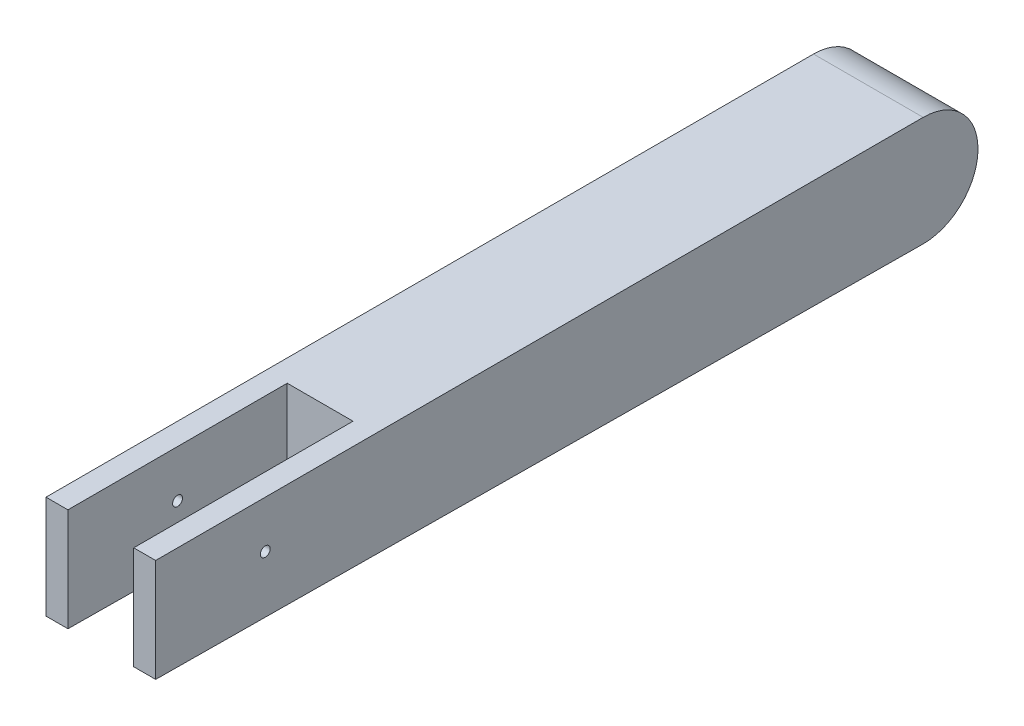
ISO-10303-21;
HEADER;
FILE_DESCRIPTION(('STEP AP214'),'2;1');
FILE_NAME('part.step','',(''),(''),'','','');
FILE_SCHEMA(('AUTOMOTIVE_DESIGN { 1 0 10303 214 1 1 1 1 }'));
ENDSEC;
DATA;
#1=APPLICATION_CONTEXT('core data for automotive mechanical design processes');
#2=APPLICATION_PROTOCOL_DEFINITION('international standard','automotive_design',2000,#1);
#3=PRODUCT_CONTEXT('',#1,'mechanical');
#4=PRODUCT('Part','Part','',(#3));
#5=PRODUCT_RELATED_PRODUCT_CATEGORY('part','',(#4));
#6=PRODUCT_DEFINITION_FORMATION('','',#4);
#7=PRODUCT_DEFINITION_CONTEXT('part definition',#1,'design');
#8=PRODUCT_DEFINITION('design','',#6,#7);
#9=PRODUCT_DEFINITION_SHAPE('','',#8);
#10=(LENGTH_UNIT() NAMED_UNIT(*) SI_UNIT(.MILLI.,.METRE.));
#11=(NAMED_UNIT(*) PLANE_ANGLE_UNIT() SI_UNIT($,.RADIAN.));
#12=(NAMED_UNIT(*) SI_UNIT($,.STERADIAN.) SOLID_ANGLE_UNIT());
#13=UNCERTAINTY_MEASURE_WITH_UNIT(LENGTH_MEASURE(1.E-05),#10,'distance_accuracy_value','');
#14=(GEOMETRIC_REPRESENTATION_CONTEXT(3) GLOBAL_UNCERTAINTY_ASSIGNED_CONTEXT((#13)) GLOBAL_UNIT_ASSIGNED_CONTEXT((#10,
#11,#12)) REPRESENTATION_CONTEXT('',''));
#15=CARTESIAN_POINT('',(0.,0.,0.));
#16=DIRECTION('',(0.,0.,1.));
#17=DIRECTION('',(1.,0.,0.));
#18=AXIS2_PLACEMENT_3D('',#15,#16,#17);
#19=CARTESIAN_POINT('',(50.,0.,209.888268156425));
#20=DIRECTION('',(0.,0.,-1.));
#21=DIRECTION('',(-1.,0.,0.));
#22=AXIS2_PLACEMENT_3D('',#19,#20,#21);
#23=PLANE('',#22);
#24=DIRECTION('',(-1.,0.,0.));
#25=VECTOR('',#24,1.);
#26=CARTESIAN_POINT('',(50.,-11.5642458100559,209.888268156425));
#27=LINE('',#26,#25);
#28=CARTESIAN_POINT('',(10.,-11.5642458100559,209.888268156425));
#29=VERTEX_POINT('',#28);
#30=CARTESIAN_POINT('',(0.,-11.5642458100559,209.888268156425));
#31=VERTEX_POINT('',#30);
#32=EDGE_CURVE('E83',#29,#31,#27,.T.);
#33=ORIENTED_EDGE('',*,*,#32,.F.);
#34=DIRECTION('',(0.,1.,0.));
#35=VECTOR('',#34,1.);
#36=CARTESIAN_POINT('',(10.,0.,209.888268156425));
#37=LINE('',#36,#35);
#38=CARTESIAN_POINT('',(10.,35.4189944134078,209.888268156425));
#39=VERTEX_POINT('',#38);
#40=EDGE_CURVE('E11',#29,#39,#37,.T.);
#41=ORIENTED_EDGE('',*,*,#40,.T.);
#42=DIRECTION('',(-1.,0.,0.));
#43=VECTOR('',#42,1.);
#44=CARTESIAN_POINT('',(50.,35.4189944134078,209.888268156425));
#45=LINE('',#44,#43);
#46=CARTESIAN_POINT('',(0.,35.4189944134078,209.888268156425));
#47=VERTEX_POINT('',#46);
#48=EDGE_CURVE('E130',#39,#47,#45,.T.);
#49=ORIENTED_EDGE('',*,*,#48,.T.);
#50=DIRECTION('',(0.,-1.,0.));
#51=VECTOR('',#50,1.);
#52=CARTESIAN_POINT('',(0.,0.,209.888268156425));
#53=LINE('',#52,#51);
#54=EDGE_CURVE('E160',#47,#31,#53,.T.);
#55=ORIENTED_EDGE('',*,*,#54,.T.);
#56=EDGE_LOOP('',(#33,#41,#49,#55));
#57=FACE_BOUND('',#56,.T.);
#58=ADVANCED_FACE('F35',(#57),#23,.F.);
#59=CARTESIAN_POINT('',(50.,-13.3723451583148,0.115260437118755));
#60=DIRECTION('',(0.,-0.999962855785767,0.00861899348961394));
#61=DIRECTION('',(0.,-0.00861899348961394,-0.999962855785767));
#62=AXIS2_PLACEMENT_3D('',#59,#60,#61);
#63=PLANE('',#62);
#64=DIRECTION('',(0.,-0.00861899348961394,-0.999962855785767));
#65=VECTOR('',#64,1.);
#66=CARTESIAN_POINT('',(9.99999999999999,-13.3723451583148,0.115260437118756));
#67=LINE('',#66,#65);
#68=CARTESIAN_POINT('',(10.,-12.4261771747805,109.888268156425));
#69=VERTEX_POINT('',#68);
#70=EDGE_CURVE('E155',#29,#69,#67,.T.);
#71=ORIENTED_EDGE('',*,*,#70,.F.);
#72=ORIENTED_EDGE('',*,*,#32,.T.);
#73=DIRECTION('',(0.,0.00861899348961394,0.999962855785767));
#74=VECTOR('',#73,1.);
#75=CARTESIAN_POINT('',(0.,-13.3723451583148,0.115260437118755));
#76=LINE('',#75,#74);
#77=CARTESIAN_POINT('',(0.,-14.5810055865922,-140.111731843575));
#78=VERTEX_POINT('',#77);
#79=EDGE_CURVE('E149',#78,#31,#76,.T.);
#80=ORIENTED_EDGE('',*,*,#79,.F.);
#81=DIRECTION('',(-1.,0.,0.));
#82=VECTOR('',#81,1.);
#83=CARTESIAN_POINT('',(50.,-14.5810055865922,-140.111731843575));
#84=LINE('',#83,#82);
#85=CARTESIAN_POINT('',(50.,-14.5810055865922,-140.111731843575));
#86=VERTEX_POINT('',#85);
#87=EDGE_CURVE('E88',#86,#78,#84,.T.);
#88=ORIENTED_EDGE('',*,*,#87,.F.);
#89=DIRECTION('',(0.,0.00861899348961394,0.999962855785767));
#90=VECTOR('',#89,1.);
#91=CARTESIAN_POINT('',(50.,-13.3723451583148,0.115260437118755));
#92=LINE('',#91,#90);
#93=CARTESIAN_POINT('',(50.,-11.5642458100559,209.888268156425));
#94=VERTEX_POINT('',#93);
#95=EDGE_CURVE('E161',#86,#94,#92,.T.);
#96=ORIENTED_EDGE('',*,*,#95,.T.);
#97=CARTESIAN_POINT('',(40.,-11.5642458100559,209.888268156425));
#98=VERTEX_POINT('',#97);
#99=EDGE_CURVE('E133',#94,#98,#27,.T.);
#100=ORIENTED_EDGE('',*,*,#99,.T.);
#101=DIRECTION('',(0.,0.00861899348961394,0.999962855785767));
#102=VECTOR('',#101,1.);
#103=CARTESIAN_POINT('',(40.,-13.3723451583148,0.115260437118756));
#104=LINE('',#103,#102);
#105=CARTESIAN_POINT('',(40.,-12.4261771747805,109.888268156425));
#106=VERTEX_POINT('',#105);
#107=EDGE_CURVE('E51',#106,#98,#104,.T.);
#108=ORIENTED_EDGE('',*,*,#107,.F.);
#109=DIRECTION('',(1.,0.,0.));
#110=VECTOR('',#109,1.);
#111=CARTESIAN_POINT('',(50.,-12.4261771747805,109.888268156425));
#112=LINE('',#111,#110);
#113=EDGE_CURVE('E153',#69,#106,#112,.T.);
#114=ORIENTED_EDGE('',*,*,#113,.F.);
#115=EDGE_LOOP('',(#71,#72,#80,#88,#96,#100,#108,#114));
#116=FACE_BOUND('',#115,.T.);
#117=ADVANCED_FACE('F37',(#116),#63,.T.);
#118=CARTESIAN_POINT('',(50.,10.4189944134078,-140.111731843575));
#119=DIRECTION('',(-1.,0.,0.));
#120=DIRECTION('',(0.,0.,1.));
#121=AXIS2_PLACEMENT_3D('',#118,#119,#120);
#122=CYLINDRICAL_SURFACE('',#121,25.);
#123=CARTESIAN_POINT('',(0.,10.4189944134078,-140.111731843575));
#124=DIRECTION('',(1.,0.,0.));
#125=DIRECTION('',(0.,0.,-1.));
#126=AXIS2_PLACEMENT_3D('',#123,#124,#125);
#127=CIRCLE('',#126,25.);
#128=CARTESIAN_POINT('',(0.,35.4189944134078,-140.111731843575));
#129=VERTEX_POINT('',#128);
#130=EDGE_CURVE('E142',#78,#129,#127,.T.);
#131=ORIENTED_EDGE('',*,*,#130,.T.);
#132=DIRECTION('',(-1.,0.,0.));
#133=VECTOR('',#132,1.);
#134=CARTESIAN_POINT('',(50.,35.4189944134078,-140.111731843575));
#135=LINE('',#134,#133);
#136=CARTESIAN_POINT('',(50.,35.4189944134078,-140.111731843575));
#137=VERTEX_POINT('',#136);
#138=EDGE_CURVE('E129',#137,#129,#135,.T.);
#139=ORIENTED_EDGE('',*,*,#138,.F.);
#140=CARTESIAN_POINT('',(50.,10.4189944134078,-140.111731843575));
#141=DIRECTION('',(1.,0.,0.));
#142=DIRECTION('',(0.,0.,-1.));
#143=AXIS2_PLACEMENT_3D('',#140,#141,#142);
#144=CIRCLE('',#143,25.);
#145=EDGE_CURVE('E144',#86,#137,#144,.T.);
#146=ORIENTED_EDGE('',*,*,#145,.F.);
#147=ORIENTED_EDGE('',*,*,#87,.T.);
#148=EDGE_LOOP('',(#131,#139,#146,#147));
#149=FACE_BOUND('',#148,.T.);
#150=ADVANCED_FACE('F140',(#149),#122,.T.);
#151=CARTESIAN_POINT('',(50.,35.4189944134078,0.));
#152=DIRECTION('',(0.,1.,0.));
#153=DIRECTION('',(0.,0.,1.));
#154=AXIS2_PLACEMENT_3D('',#151,#152,#153);
#155=PLANE('',#154);
#156=DIRECTION('',(0.,0.,1.));
#157=VECTOR('',#156,1.);
#158=CARTESIAN_POINT('',(10.,35.4189944134078,209.888268156425));
#159=LINE('',#158,#157);
#160=CARTESIAN_POINT('',(10.,35.4189944134078,109.888268156425));
#161=VERTEX_POINT('',#160);
#162=EDGE_CURVE('E173',#161,#39,#159,.T.);
#163=ORIENTED_EDGE('',*,*,#162,.F.);
#164=DIRECTION('',(-1.,0.,0.));
#165=VECTOR('',#164,1.);
#166=CARTESIAN_POINT('',(10.,35.4189944134078,109.888268156425));
#167=LINE('',#166,#165);
#168=CARTESIAN_POINT('',(40.,35.4189944134078,109.888268156425));
#169=VERTEX_POINT('',#168);
#170=EDGE_CURVE('E125',#169,#161,#167,.T.);
#171=ORIENTED_EDGE('',*,*,#170,.F.);
#172=DIRECTION('',(0.,0.,-1.));
#173=VECTOR('',#172,1.);
#174=CARTESIAN_POINT('',(40.,35.4189944134078,109.888268156425));
#175=LINE('',#174,#173);
#176=CARTESIAN_POINT('',(40.,35.4189944134078,209.888268156425));
#177=VERTEX_POINT('',#176);
#178=EDGE_CURVE('E113',#177,#169,#175,.T.);
#179=ORIENTED_EDGE('',*,*,#178,.F.);
#180=CARTESIAN_POINT('',(50.,35.4189944134078,209.888268156425));
#181=VERTEX_POINT('',#180);
#182=EDGE_CURVE('E123',#181,#177,#45,.T.);
#183=ORIENTED_EDGE('',*,*,#182,.F.);
#184=DIRECTION('',(0.,0.,-1.));
#185=VECTOR('',#184,1.);
#186=CARTESIAN_POINT('',(50.,35.4189944134078,0.));
#187=LINE('',#186,#185);
#188=EDGE_CURVE('E164',#181,#137,#187,.T.);
#189=ORIENTED_EDGE('',*,*,#188,.T.);
#190=ORIENTED_EDGE('',*,*,#138,.T.);
#191=DIRECTION('',(0.,0.,-1.));
#192=VECTOR('',#191,1.);
#193=CARTESIAN_POINT('',(0.,35.4189944134078,0.));
#194=LINE('',#193,#192);
#195=EDGE_CURVE('E151',#47,#129,#194,.T.);
#196=ORIENTED_EDGE('',*,*,#195,.F.);
#197=ORIENTED_EDGE('',*,*,#48,.F.);
#198=EDGE_LOOP('',(#163,#171,#179,#183,#189,#190,#196,#197));
#199=FACE_BOUND('',#198,.T.);
#200=ADVANCED_FACE('F121',(#199),#155,.T.);
#201=ORIENTED_EDGE('',*,*,#182,.T.);
#202=DIRECTION('',(0.,-1.,0.));
#203=VECTOR('',#202,1.);
#204=CARTESIAN_POINT('',(40.,0.,209.888268156425));
#205=LINE('',#204,#203);
#206=EDGE_CURVE('E44',#177,#98,#205,.T.);
#207=ORIENTED_EDGE('',*,*,#206,.T.);
#208=ORIENTED_EDGE('',*,*,#99,.F.);
#209=DIRECTION('',(0.,-1.,0.));
#210=VECTOR('',#209,1.);
#211=CARTESIAN_POINT('',(50.,0.,209.888268156425));
#212=LINE('',#211,#210);
#213=EDGE_CURVE('E60',#181,#94,#212,.T.);
#214=ORIENTED_EDGE('',*,*,#213,.F.);
#215=EDGE_LOOP('',(#201,#207,#208,#214));
#216=FACE_BOUND('',#215,.T.);
#217=ADVANCED_FACE('F128',(#216),#23,.F.);
#218=CARTESIAN_POINT('',(50.,0.,0.));
#219=DIRECTION('',(1.,0.,0.));
#220=DIRECTION('',(0.,0.,-1.));
#221=AXIS2_PLACEMENT_3D('',#218,#219,#220);
#222=PLANE('',#221);
#223=CARTESIAN_POINT('',(50.,13.9451269071097,159.888268156425));
#224=DIRECTION('',(1.,0.,0.));
#225=DIRECTION('',(0.,0.,-1.));
#226=AXIS2_PLACEMENT_3D('',#223,#224,#225);
#227=CIRCLE('',#226,2.25000000000001);
#228=CARTESIAN_POINT('',(50.,13.9451269071097,157.638268156425));
#229=VERTEX_POINT('',#228);
#230=EDGE_CURVE('E179',#229,#229,#227,.T.);
#231=ORIENTED_EDGE('',*,*,#230,.F.);
#232=EDGE_LOOP('',(#231));
#233=FACE_BOUND('',#232,.T.);
#234=ORIENTED_EDGE('',*,*,#95,.F.);
#235=ORIENTED_EDGE('',*,*,#145,.T.);
#236=ORIENTED_EDGE('',*,*,#188,.F.);
#237=ORIENTED_EDGE('',*,*,#213,.T.);
#238=EDGE_LOOP('',(#234,#235,#236,#237));
#239=FACE_BOUND('',#238,.T.);
#240=ADVANCED_FACE('F211',(#233,#239),#222,.T.);
#241=CARTESIAN_POINT('',(0.,0.,0.));
#242=DIRECTION('',(1.,0.,0.));
#243=DIRECTION('',(0.,0.,-1.));
#244=AXIS2_PLACEMENT_3D('',#241,#242,#243);
#245=PLANE('',#244);
#246=CARTESIAN_POINT('',(0.,13.9451269071097,159.888268156425));
#247=DIRECTION('',(1.,0.,0.));
#248=DIRECTION('',(0.,0.,-1.));
#249=AXIS2_PLACEMENT_3D('',#246,#247,#248);
#250=CIRCLE('',#249,2.25000000000001);
#251=CARTESIAN_POINT('',(0.,13.9451269071097,157.638268156425));
#252=VERTEX_POINT('',#251);
#253=EDGE_CURVE('E182',#252,#252,#250,.T.);
#254=ORIENTED_EDGE('',*,*,#253,.T.);
#255=EDGE_LOOP('',(#254));
#256=FACE_BOUND('',#255,.T.);
#257=ORIENTED_EDGE('',*,*,#79,.T.);
#258=ORIENTED_EDGE('',*,*,#54,.F.);
#259=ORIENTED_EDGE('',*,*,#195,.T.);
#260=ORIENTED_EDGE('',*,*,#130,.F.);
#261=EDGE_LOOP('',(#257,#258,#259,#260));
#262=FACE_BOUND('',#261,.T.);
#263=ADVANCED_FACE('F147',(#256,#262),#245,.F.);
#264=CARTESIAN_POINT('',(10.,-14.5810055865922,209.888268156425));
#265=DIRECTION('',(-1.,0.,0.));
#266=DIRECTION('',(0.,0.,1.));
#267=AXIS2_PLACEMENT_3D('',#264,#265,#266);
#268=PLANE('',#267);
#269=CARTESIAN_POINT('',(10.,13.9451269071097,159.888268156425));
#270=DIRECTION('',(-1.,0.,0.));
#271=DIRECTION('',(0.,0.,1.));
#272=AXIS2_PLACEMENT_3D('',#269,#270,#271);
#273=CIRCLE('',#272,2.25000000000001);
#274=CARTESIAN_POINT('',(10.,13.9451269071097,162.138268156425));
#275=VERTEX_POINT('',#274);
#276=EDGE_CURVE('E126',#275,#275,#273,.T.);
#277=ORIENTED_EDGE('',*,*,#276,.T.);
#278=EDGE_LOOP('',(#277));
#279=FACE_BOUND('',#278,.T.);
#280=ORIENTED_EDGE('',*,*,#70,.T.);
#281=DIRECTION('',(0.,1.,0.));
#282=VECTOR('',#281,1.);
#283=CARTESIAN_POINT('',(10.,-14.5810055865922,109.888268156425));
#284=LINE('',#283,#282);
#285=EDGE_CURVE('E168',#69,#161,#284,.T.);
#286=ORIENTED_EDGE('',*,*,#285,.T.);
#287=ORIENTED_EDGE('',*,*,#162,.T.);
#288=ORIENTED_EDGE('',*,*,#40,.F.);
#289=EDGE_LOOP('',(#280,#286,#287,#288));
#290=FACE_BOUND('',#289,.T.);
#291=ADVANCED_FACE('F248',(#279,#290),#268,.F.);
#292=CARTESIAN_POINT('',(10.,-14.5810055865922,109.888268156425));
#293=DIRECTION('',(0.,0.,-1.));
#294=DIRECTION('',(-1.,0.,0.));
#295=AXIS2_PLACEMENT_3D('',#292,#293,#294);
#296=PLANE('',#295);
#297=ORIENTED_EDGE('',*,*,#113,.T.);
#298=DIRECTION('',(0.,1.,0.));
#299=VECTOR('',#298,1.);
#300=CARTESIAN_POINT('',(40.,-14.5810055865922,109.888268156425));
#301=LINE('',#300,#299);
#302=EDGE_CURVE('E170',#106,#169,#301,.T.);
#303=ORIENTED_EDGE('',*,*,#302,.T.);
#304=ORIENTED_EDGE('',*,*,#170,.T.);
#305=ORIENTED_EDGE('',*,*,#285,.F.);
#306=EDGE_LOOP('',(#297,#303,#304,#305));
#307=FACE_BOUND('',#306,.T.);
#308=ADVANCED_FACE('F200',(#307),#296,.F.);
#309=CARTESIAN_POINT('',(40.,-14.5810055865922,109.888268156425));
#310=DIRECTION('',(1.,0.,0.));
#311=DIRECTION('',(0.,0.,-1.));
#312=AXIS2_PLACEMENT_3D('',#309,#310,#311);
#313=PLANE('',#312);
#314=CARTESIAN_POINT('',(40.,13.9451269071097,159.888268156425));
#315=DIRECTION('',(1.,0.,0.));
#316=DIRECTION('',(0.,0.,-1.));
#317=AXIS2_PLACEMENT_3D('',#314,#315,#316);
#318=CIRCLE('',#317,2.25000000000001);
#319=CARTESIAN_POINT('',(40.,13.9451269071097,157.638268156425));
#320=VERTEX_POINT('',#319);
#321=EDGE_CURVE('E39',#320,#320,#318,.T.);
#322=ORIENTED_EDGE('',*,*,#321,.T.);
#323=EDGE_LOOP('',(#322));
#324=FACE_BOUND('',#323,.T.);
#325=ORIENTED_EDGE('',*,*,#107,.T.);
#326=ORIENTED_EDGE('',*,*,#206,.F.);
#327=ORIENTED_EDGE('',*,*,#178,.T.);
#328=ORIENTED_EDGE('',*,*,#302,.F.);
#329=EDGE_LOOP('',(#325,#326,#327,#328));
#330=FACE_BOUND('',#329,.T.);
#331=ADVANCED_FACE('F112',(#324,#330),#313,.F.);
#332=CARTESIAN_POINT('',(0.,13.9451269071097,159.888268156425));
#333=DIRECTION('',(1.,0.,0.));
#334=DIRECTION('',(0.,0.,-1.));
#335=AXIS2_PLACEMENT_3D('',#332,#333,#334);
#336=CYLINDRICAL_SURFACE('',#335,2.25000000000001);
#337=ORIENTED_EDGE('',*,*,#230,.T.);
#338=EDGE_LOOP('',(#337));
#339=FACE_BOUND('',#338,.T.);
#340=ORIENTED_EDGE('',*,*,#321,.F.);
#341=EDGE_LOOP('',(#340));
#342=FACE_BOUND('',#341,.T.);
#343=ADVANCED_FACE('F190',(#339,#342),#336,.F.);
#344=ORIENTED_EDGE('',*,*,#253,.F.);
#345=EDGE_LOOP('',(#344));
#346=FACE_BOUND('',#345,.T.);
#347=ORIENTED_EDGE('',*,*,#276,.F.);
#348=EDGE_LOOP('',(#347));
#349=FACE_BOUND('',#348,.T.);
#350=ADVANCED_FACE('F192',(#346,#349),#336,.F.);
#351=CLOSED_SHELL('',(#58,#117,#150,#200,#217,#240,#263,#291,#308,#331,#343,#350));
#352=MANIFOLD_SOLID_BREP('B2',#351);
#353=ADVANCED_BREP_SHAPE_REPRESENTATION('',(#18,#352),#14);
#354=SHAPE_DEFINITION_REPRESENTATION(#9,#353);
ENDSEC;
END-ISO-10303-21;
